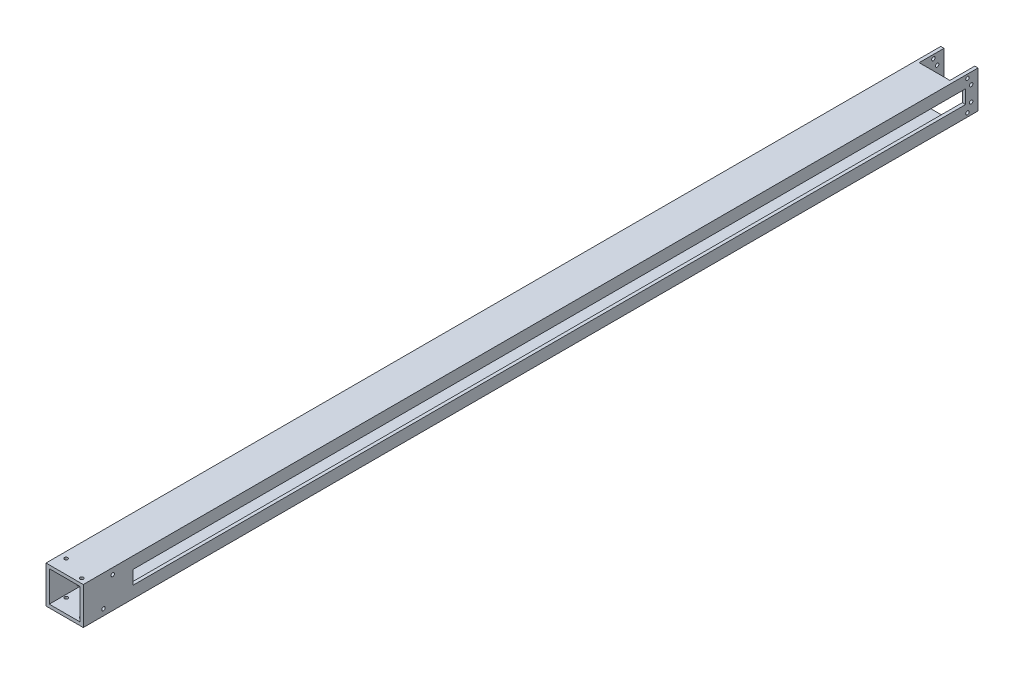
ISO-10303-21;
HEADER;
FILE_DESCRIPTION(('STEP AP214'),'2;1');
FILE_NAME('part.step','',(''),(''),'','','');
FILE_SCHEMA(('AUTOMOTIVE_DESIGN { 1 0 10303 214 1 1 1 1 }'));
ENDSEC;
DATA;
#1=APPLICATION_CONTEXT('core data for automotive mechanical design processes');
#2=APPLICATION_PROTOCOL_DEFINITION('international standard','automotive_design',2000,#1);
#3=PRODUCT_CONTEXT('',#1,'mechanical');
#4=PRODUCT('Part','Part','',(#3));
#5=PRODUCT_RELATED_PRODUCT_CATEGORY('part','',(#4));
#6=PRODUCT_DEFINITION_FORMATION('','',#4);
#7=PRODUCT_DEFINITION_CONTEXT('part definition',#1,'design');
#8=PRODUCT_DEFINITION('design','',#6,#7);
#9=PRODUCT_DEFINITION_SHAPE('','',#8);
#10=(LENGTH_UNIT() NAMED_UNIT(*) SI_UNIT(.MILLI.,.METRE.));
#11=(NAMED_UNIT(*) PLANE_ANGLE_UNIT() SI_UNIT($,.RADIAN.));
#12=(NAMED_UNIT(*) SI_UNIT($,.STERADIAN.) SOLID_ANGLE_UNIT());
#13=UNCERTAINTY_MEASURE_WITH_UNIT(LENGTH_MEASURE(1.E-05),#10,'distance_accuracy_value','');
#14=(GEOMETRIC_REPRESENTATION_CONTEXT(3) GLOBAL_UNCERTAINTY_ASSIGNED_CONTEXT((#13)) GLOBAL_UNIT_ASSIGNED_CONTEXT((#10,
#11,#12)) REPRESENTATION_CONTEXT('',''));
#15=CARTESIAN_POINT('',(0.,0.,0.));
#16=DIRECTION('',(0.,0.,1.));
#17=DIRECTION('',(1.,0.,0.));
#18=AXIS2_PLACEMENT_3D('',#15,#16,#17);
#19=CARTESIAN_POINT('',(0.,0.,0.));
#20=DIRECTION('',(0.,0.,1.));
#21=DIRECTION('',(1.,0.,0.));
#22=AXIS2_PLACEMENT_3D('',#19,#20,#21);
#23=PLANE('',#22);
#24=DIRECTION('',(-1.,0.,0.));
#25=VECTOR('',#24,1.);
#26=CARTESIAN_POINT('',(0.,-19.05,0.));
#27=LINE('',#26,#25);
#28=CARTESIAN_POINT('',(19.05,-19.05,0.));
#29=VERTEX_POINT('',#28);
#30=CARTESIAN_POINT('',(15.71625,-19.05,0.));
#31=VERTEX_POINT('',#30);
#32=EDGE_CURVE('E311',#29,#31,#27,.T.);
#33=ORIENTED_EDGE('',*,*,#32,.T.);
#34=DIRECTION('',(0.,-1.,0.));
#35=VECTOR('',#34,1.);
#36=CARTESIAN_POINT('',(15.71625,0.,0.));
#37=LINE('',#36,#35);
#38=CARTESIAN_POINT('',(15.71625,19.05,0.));
#39=VERTEX_POINT('',#38);
#40=EDGE_CURVE('E306',#39,#31,#37,.T.);
#41=ORIENTED_EDGE('',*,*,#40,.F.);
#42=DIRECTION('',(-1.,0.,0.));
#43=VECTOR('',#42,1.);
#44=CARTESIAN_POINT('',(0.,19.05,0.));
#45=LINE('',#44,#43);
#46=CARTESIAN_POINT('',(19.05,19.05,0.));
#47=VERTEX_POINT('',#46);
#48=EDGE_CURVE('E312',#47,#39,#45,.T.);
#49=ORIENTED_EDGE('',*,*,#48,.F.);
#50=DIRECTION('',(0.,-1.,0.));
#51=VECTOR('',#50,1.);
#52=CARTESIAN_POINT('',(19.05,0.,0.));
#53=LINE('',#52,#51);
#54=EDGE_CURVE('E308',#47,#29,#53,.T.);
#55=ORIENTED_EDGE('',*,*,#54,.T.);
#56=EDGE_LOOP('',(#33,#41,#49,#55));
#57=FACE_BOUND('',#56,.T.);
#58=ADVANCED_FACE('F41',(#57),#23,.F.);
#59=CARTESIAN_POINT('',(0.,6.98500000000004,914.4));
#60=DIRECTION('',(0.,1.,0.));
#61=DIRECTION('',(-1.,0.,0.));
#62=AXIS2_PLACEMENT_3D('',#59,#60,#61);
#63=PLANE('',#62);
#64=DIRECTION('',(0.,0.,-1.));
#65=VECTOR('',#64,1.);
#66=CARTESIAN_POINT('',(19.05,6.985,914.4));
#67=LINE('',#66,#65);
#68=CARTESIAN_POINT('',(19.05,6.985,863.6));
#69=VERTEX_POINT('',#68);
#70=CARTESIAN_POINT('',(19.05,6.985,12.7));
#71=VERTEX_POINT('',#70);
#72=EDGE_CURVE('E58',#69,#71,#67,.T.);
#73=ORIENTED_EDGE('',*,*,#72,.F.);
#74=DIRECTION('',(-1.,0.,0.));
#75=VECTOR('',#74,1.);
#76=CARTESIAN_POINT('',(0.,6.98500000000004,863.6));
#77=LINE('',#76,#75);
#78=CARTESIAN_POINT('',(15.71625,6.985,863.6));
#79=VERTEX_POINT('',#78);
#80=EDGE_CURVE('E160',#69,#79,#77,.T.);
#81=ORIENTED_EDGE('',*,*,#80,.T.);
#82=DIRECTION('',(0.,0.,-1.));
#83=VECTOR('',#82,1.);
#84=CARTESIAN_POINT('',(15.71625,6.985,914.4));
#85=LINE('',#84,#83);
#86=CARTESIAN_POINT('',(15.71625,6.985,12.7));
#87=VERTEX_POINT('',#86);
#88=EDGE_CURVE('E50',#79,#87,#85,.T.);
#89=ORIENTED_EDGE('',*,*,#88,.T.);
#90=DIRECTION('',(1.,0.,0.));
#91=VECTOR('',#90,1.);
#92=CARTESIAN_POINT('',(-3.16365730909453,6.985,12.7));
#93=LINE('',#92,#91);
#94=EDGE_CURVE('E226',#87,#71,#93,.T.);
#95=ORIENTED_EDGE('',*,*,#94,.T.);
#96=EDGE_LOOP('',(#73,#81,#89,#95));
#97=FACE_BOUND('',#96,.T.);
#98=ADVANCED_FACE('F43',(#97),#63,.F.);
#99=CARTESIAN_POINT('',(0.,19.05,914.4));
#100=DIRECTION('',(0.,-1.,0.));
#101=DIRECTION('',(0.,0.,-1.));
#102=AXIS2_PLACEMENT_3D('',#99,#100,#101);
#103=PLANE('',#102);
#104=DIRECTION('',(0.,0.,-1.));
#105=VECTOR('',#104,1.);
#106=CARTESIAN_POINT('',(19.05,19.05,914.4));
#107=LINE('',#106,#105);
#108=CARTESIAN_POINT('',(19.05,19.05,914.4));
#109=VERTEX_POINT('',#108);
#110=EDGE_CURVE('E343',#109,#47,#107,.T.);
#111=ORIENTED_EDGE('',*,*,#110,.T.);
#112=ORIENTED_EDGE('',*,*,#48,.T.);
#113=DIRECTION('',(0.,0.,-1.));
#114=VECTOR('',#113,1.);
#115=CARTESIAN_POINT('',(15.71625,19.05,-25.4));
#116=LINE('',#115,#114);
#117=CARTESIAN_POINT('',(15.71625,19.05,25.4));
#118=VERTEX_POINT('',#117);
#119=EDGE_CURVE('E239',#118,#39,#116,.T.);
#120=ORIENTED_EDGE('',*,*,#119,.F.);
#121=DIRECTION('',(1.,0.,0.));
#122=VECTOR('',#121,1.);
#123=CARTESIAN_POINT('',(-15.71625,19.05,25.4));
#124=LINE('',#123,#122);
#125=CARTESIAN_POINT('',(-15.71625,19.05,25.4));
#126=VERTEX_POINT('',#125);
#127=EDGE_CURVE('E245',#126,#118,#124,.T.);
#128=ORIENTED_EDGE('',*,*,#127,.F.);
#129=DIRECTION('',(0.,0.,1.));
#130=VECTOR('',#129,1.);
#131=CARTESIAN_POINT('',(-15.71625,19.05,-25.4));
#132=LINE('',#131,#130);
#133=CARTESIAN_POINT('',(-15.71625,19.05,0.));
#134=VERTEX_POINT('',#133);
#135=EDGE_CURVE('E242',#134,#126,#132,.T.);
#136=ORIENTED_EDGE('',*,*,#135,.F.);
#137=CARTESIAN_POINT('',(-19.05,19.05,0.));
#138=VERTEX_POINT('',#137);
#139=EDGE_CURVE('E284',#134,#138,#45,.T.);
#140=ORIENTED_EDGE('',*,*,#139,.T.);
#141=DIRECTION('',(0.,0.,-1.));
#142=VECTOR('',#141,1.);
#143=CARTESIAN_POINT('',(-19.05,19.05,914.4));
#144=LINE('',#143,#142);
#145=CARTESIAN_POINT('',(-19.05,19.05,914.4));
#146=VERTEX_POINT('',#145);
#147=EDGE_CURVE('E340',#146,#138,#144,.T.);
#148=ORIENTED_EDGE('',*,*,#147,.F.);
#149=DIRECTION('',(-1.,0.,0.));
#150=VECTOR('',#149,1.);
#151=CARTESIAN_POINT('',(0.,19.05,914.4));
#152=LINE('',#151,#150);
#153=EDGE_CURVE('E290',#109,#146,#152,.T.);
#154=ORIENTED_EDGE('',*,*,#153,.F.);
#155=EDGE_LOOP('',(#111,#112,#120,#128,#136,#140,#148,#154));
#156=FACE_BOUND('',#155,.T.);
#157=CARTESIAN_POINT('',(12.7,19.05,909.6375));
#158=DIRECTION('',(0.,-1.,0.));
#159=DIRECTION('',(0.,0.,-1.));
#160=AXIS2_PLACEMENT_3D('',#157,#158,#159);
#161=CIRCLE('',#160,1.7499999999999);
#162=CARTESIAN_POINT('',(12.7,19.05,907.8875));
#163=VERTEX_POINT('',#162);
#164=EDGE_CURVE('E281',#163,#163,#161,.T.);
#165=ORIENTED_EDGE('',*,*,#164,.T.);
#166=EDGE_LOOP('',(#165));
#167=FACE_BOUND('',#166,.T.);
#168=CARTESIAN_POINT('',(-12.7,19.05,900.1125));
#169=DIRECTION('',(0.,-1.,0.));
#170=DIRECTION('',(0.,0.,-1.));
#171=AXIS2_PLACEMENT_3D('',#168,#169,#170);
#172=CIRCLE('',#171,1.74999999999988);
#173=CARTESIAN_POINT('',(-12.7,19.05,898.3625));
#174=VERTEX_POINT('',#173);
#175=EDGE_CURVE('E271',#174,#174,#172,.T.);
#176=ORIENTED_EDGE('',*,*,#175,.T.);
#177=EDGE_LOOP('',(#176));
#178=FACE_BOUND('',#177,.T.);
#179=ADVANCED_FACE('F431',(#156,#167,#178),#103,.F.);
#180=CARTESIAN_POINT('',(-19.05,0.,914.4));
#181=DIRECTION('',(1.,0.,0.));
#182=DIRECTION('',(0.,1.,0.));
#183=AXIS2_PLACEMENT_3D('',#180,#181,#182);
#184=PLANE('',#183);
#185=CARTESIAN_POINT('',(-19.05,-12.7,884.2375));
#186=DIRECTION('',(-1.,0.,0.));
#187=DIRECTION('',(0.,-1.,0.));
#188=AXIS2_PLACEMENT_3D('',#185,#186,#187);
#189=CIRCLE('',#188,1.74999999999986);
#190=CARTESIAN_POINT('',(-19.05,-14.4499999999999,884.2375));
#191=VERTEX_POINT('',#190);
#192=EDGE_CURVE('E163',#191,#191,#189,.T.);
#193=ORIENTED_EDGE('',*,*,#192,.F.);
#194=EDGE_LOOP('',(#193));
#195=FACE_BOUND('',#194,.T.);
#196=CARTESIAN_POINT('',(-19.05,12.7,893.7625));
#197=DIRECTION('',(-1.,0.,0.));
#198=DIRECTION('',(0.,-1.,0.));
#199=AXIS2_PLACEMENT_3D('',#196,#197,#198);
#200=CIRCLE('',#199,1.74999999999987);
#201=CARTESIAN_POINT('',(-19.05,10.9500000000001,893.7625));
#202=VERTEX_POINT('',#201);
#203=EDGE_CURVE('E176',#202,#202,#200,.T.);
#204=ORIENTED_EDGE('',*,*,#203,.F.);
#205=EDGE_LOOP('',(#204));
#206=FACE_BOUND('',#205,.T.);
#207=CARTESIAN_POINT('',(-19.05,-15.24,10.795));
#208=DIRECTION('',(1.,0.,0.));
#209=DIRECTION('',(0.,1.,0.));
#210=AXIS2_PLACEMENT_3D('',#207,#208,#209);
#211=CIRCLE('',#210,1.75);
#212=CARTESIAN_POINT('',(-19.05,-13.49,10.795));
#213=VERTEX_POINT('',#212);
#214=EDGE_CURVE('E217',#213,#213,#211,.T.);
#215=ORIENTED_EDGE('',*,*,#214,.T.);
#216=EDGE_LOOP('',(#215));
#217=FACE_BOUND('',#216,.T.);
#218=CARTESIAN_POINT('',(-19.05,7.62,6.985));
#219=DIRECTION('',(1.,0.,0.));
#220=DIRECTION('',(0.,1.,0.));
#221=AXIS2_PLACEMENT_3D('',#218,#219,#220);
#222=CIRCLE('',#221,1.75);
#223=CARTESIAN_POINT('',(-19.05,9.37,6.985));
#224=VERTEX_POINT('',#223);
#225=EDGE_CURVE('E210',#224,#224,#222,.T.);
#226=ORIENTED_EDGE('',*,*,#225,.T.);
#227=EDGE_LOOP('',(#226));
#228=FACE_BOUND('',#227,.T.);
#229=CARTESIAN_POINT('',(-19.05,15.24,10.795));
#230=DIRECTION('',(1.,0.,0.));
#231=DIRECTION('',(0.,1.,0.));
#232=AXIS2_PLACEMENT_3D('',#229,#230,#231);
#233=CIRCLE('',#232,1.75);
#234=CARTESIAN_POINT('',(-19.05,16.99,10.795));
#235=VERTEX_POINT('',#234);
#236=EDGE_CURVE('E203',#235,#235,#233,.T.);
#237=ORIENTED_EDGE('',*,*,#236,.T.);
#238=EDGE_LOOP('',(#237));
#239=FACE_BOUND('',#238,.T.);
#240=CARTESIAN_POINT('',(-19.05,-7.62,6.985));
#241=DIRECTION('',(1.,0.,0.));
#242=DIRECTION('',(0.,1.,0.));
#243=AXIS2_PLACEMENT_3D('',#240,#241,#242);
#244=CIRCLE('',#243,1.75);
#245=CARTESIAN_POINT('',(-19.05,-5.87,6.985));
#246=VERTEX_POINT('',#245);
#247=EDGE_CURVE('E196',#246,#246,#244,.T.);
#248=ORIENTED_EDGE('',*,*,#247,.T.);
#249=EDGE_LOOP('',(#248));
#250=FACE_BOUND('',#249,.T.);
#251=DIRECTION('',(0.,-1.,0.));
#252=VECTOR('',#251,1.);
#253=CARTESIAN_POINT('',(-19.05,0.,0.));
#254=LINE('',#253,#252);
#255=CARTESIAN_POINT('',(-19.05,-19.05,0.));
#256=VERTEX_POINT('',#255);
#257=EDGE_CURVE('E315',#138,#256,#254,.T.);
#258=ORIENTED_EDGE('',*,*,#257,.T.);
#259=DIRECTION('',(0.,0.,-1.));
#260=VECTOR('',#259,1.);
#261=CARTESIAN_POINT('',(-19.05,-19.05,914.4));
#262=LINE('',#261,#260);
#263=CARTESIAN_POINT('',(-19.05,-19.05,914.4));
#264=VERTEX_POINT('',#263);
#265=EDGE_CURVE('E337',#264,#256,#262,.T.);
#266=ORIENTED_EDGE('',*,*,#265,.F.);
#267=DIRECTION('',(0.,-1.,0.));
#268=VECTOR('',#267,1.);
#269=CARTESIAN_POINT('',(-19.05,0.,914.4));
#270=LINE('',#269,#268);
#271=EDGE_CURVE('E292',#146,#264,#270,.T.);
#272=ORIENTED_EDGE('',*,*,#271,.F.);
#273=ORIENTED_EDGE('',*,*,#147,.T.);
#274=EDGE_LOOP('',(#258,#266,#272,#273));
#275=FACE_BOUND('',#274,.T.);
#276=ADVANCED_FACE('F421',(#195,#206,#217,#228,#239,#250,#275),#184,.F.);
#277=CARTESIAN_POINT('',(0.,-19.05,914.4));
#278=DIRECTION('',(0.,-1.,0.));
#279=DIRECTION('',(0.,0.,-1.));
#280=AXIS2_PLACEMENT_3D('',#277,#278,#279);
#281=PLANE('',#280);
#282=ORIENTED_EDGE('',*,*,#32,.F.);
#283=DIRECTION('',(0.,0.,-1.));
#284=VECTOR('',#283,1.);
#285=CARTESIAN_POINT('',(19.05,-19.05,914.4));
#286=LINE('',#285,#284);
#287=CARTESIAN_POINT('',(19.05,-19.05,914.4));
#288=VERTEX_POINT('',#287);
#289=EDGE_CURVE('E335',#288,#29,#286,.T.);
#290=ORIENTED_EDGE('',*,*,#289,.F.);
#291=DIRECTION('',(-1.,0.,0.));
#292=VECTOR('',#291,1.);
#293=CARTESIAN_POINT('',(0.,-19.05,914.4));
#294=LINE('',#293,#292);
#295=EDGE_CURVE('E295',#288,#264,#294,.T.);
#296=ORIENTED_EDGE('',*,*,#295,.T.);
#297=ORIENTED_EDGE('',*,*,#265,.T.);
#298=CARTESIAN_POINT('',(-15.71625,-19.05,0.));
#299=VERTEX_POINT('',#298);
#300=EDGE_CURVE('E318',#299,#256,#27,.T.);
#301=ORIENTED_EDGE('',*,*,#300,.F.);
#302=DIRECTION('',(0.,0.,-1.));
#303=VECTOR('',#302,1.);
#304=CARTESIAN_POINT('',(-15.71625,-19.05,914.4));
#305=LINE('',#304,#303);
#306=CARTESIAN_POINT('',(-15.71625,-19.05,25.4));
#307=VERTEX_POINT('',#306);
#308=EDGE_CURVE('E254',#307,#299,#305,.T.);
#309=ORIENTED_EDGE('',*,*,#308,.F.);
#310=DIRECTION('',(-1.,0.,0.));
#311=VECTOR('',#310,1.);
#312=CARTESIAN_POINT('',(-3.92503089513944E-13,-19.05,25.4));
#313=LINE('',#312,#311);
#314=CARTESIAN_POINT('',(15.71625,-19.05,25.4));
#315=VERTEX_POINT('',#314);
#316=EDGE_CURVE('E262',#315,#307,#313,.T.);
#317=ORIENTED_EDGE('',*,*,#316,.F.);
#318=DIRECTION('',(0.,0.,1.));
#319=VECTOR('',#318,1.);
#320=CARTESIAN_POINT('',(15.71625,-19.05,914.4));
#321=LINE('',#320,#319);
#322=EDGE_CURVE('E257',#31,#315,#321,.T.);
#323=ORIENTED_EDGE('',*,*,#322,.F.);
#324=EDGE_LOOP('',(#282,#290,#296,#297,#301,#309,#317,#323));
#325=FACE_BOUND('',#324,.T.);
#326=CARTESIAN_POINT('',(12.7,-19.05,909.6375));
#327=DIRECTION('',(0.,-1.,0.));
#328=DIRECTION('',(0.,0.,-1.));
#329=AXIS2_PLACEMENT_3D('',#326,#327,#328);
#330=CIRCLE('',#329,1.7499999999999);
#331=CARTESIAN_POINT('',(12.7,-19.05,907.8875));
#332=VERTEX_POINT('',#331);
#333=EDGE_CURVE('E278',#332,#332,#330,.T.);
#334=ORIENTED_EDGE('',*,*,#333,.F.);
#335=EDGE_LOOP('',(#334));
#336=FACE_BOUND('',#335,.T.);
#337=CARTESIAN_POINT('',(-12.7,-19.05,900.1125));
#338=DIRECTION('',(0.,-1.,0.));
#339=DIRECTION('',(0.,0.,-1.));
#340=AXIS2_PLACEMENT_3D('',#337,#338,#339);
#341=CIRCLE('',#340,1.74999999999988);
#342=CARTESIAN_POINT('',(-12.7,-19.05,898.3625));
#343=VERTEX_POINT('',#342);
#344=EDGE_CURVE('E268',#343,#343,#341,.T.);
#345=ORIENTED_EDGE('',*,*,#344,.F.);
#346=EDGE_LOOP('',(#345));
#347=FACE_BOUND('',#346,.T.);
#348=ADVANCED_FACE('F402',(#325,#336,#347),#281,.T.);
#349=CARTESIAN_POINT('',(19.05,0.,914.4));
#350=DIRECTION('',(1.,0.,0.));
#351=DIRECTION('',(0.,1.,0.));
#352=AXIS2_PLACEMENT_3D('',#349,#350,#351);
#353=PLANE('',#352);
#354=DIRECTION('',(0.,1.,0.));
#355=VECTOR('',#354,1.);
#356=CARTESIAN_POINT('',(19.05,-19.05,863.6));
#357=LINE('',#356,#355);
#358=CARTESIAN_POINT('',(19.05,-6.985,863.6));
#359=VERTEX_POINT('',#358);
#360=EDGE_CURVE('E169',#359,#69,#357,.T.);
#361=ORIENTED_EDGE('',*,*,#360,.T.);
#362=ORIENTED_EDGE('',*,*,#72,.T.);
#363=DIRECTION('',(0.,-1.,0.));
#364=VECTOR('',#363,1.);
#365=CARTESIAN_POINT('',(19.05,-6.985,12.7));
#366=LINE('',#365,#364);
#367=CARTESIAN_POINT('',(19.05,-6.985,12.7));
#368=VERTEX_POINT('',#367);
#369=EDGE_CURVE('E220',#71,#368,#366,.T.);
#370=ORIENTED_EDGE('',*,*,#369,.T.);
#371=DIRECTION('',(0.,0.,-1.));
#372=VECTOR('',#371,1.);
#373=CARTESIAN_POINT('',(19.05,-6.985,914.4));
#374=LINE('',#373,#372);
#375=EDGE_CURVE('E333',#359,#368,#374,.T.);
#376=ORIENTED_EDGE('',*,*,#375,.F.);
#377=EDGE_LOOP('',(#361,#362,#370,#376));
#378=FACE_BOUND('',#377,.T.);
#379=DIRECTION('',(0.,-1.,0.));
#380=VECTOR('',#379,1.);
#381=CARTESIAN_POINT('',(19.05,0.,914.4));
#382=LINE('',#381,#380);
#383=EDGE_CURVE('E287',#109,#288,#382,.T.);
#384=ORIENTED_EDGE('',*,*,#383,.T.);
#385=ORIENTED_EDGE('',*,*,#289,.T.);
#386=ORIENTED_EDGE('',*,*,#54,.F.);
#387=ORIENTED_EDGE('',*,*,#110,.F.);
#388=EDGE_LOOP('',(#384,#385,#386,#387));
#389=FACE_BOUND('',#388,.T.);
#390=CARTESIAN_POINT('',(19.05,-15.24,10.795));
#391=DIRECTION('',(1.,0.,0.));
#392=DIRECTION('',(0.,1.,0.));
#393=AXIS2_PLACEMENT_3D('',#390,#391,#392);
#394=CIRCLE('',#393,1.75);
#395=CARTESIAN_POINT('',(19.05,-13.49,10.795));
#396=VERTEX_POINT('',#395);
#397=EDGE_CURVE('E180',#396,#396,#394,.T.);
#398=ORIENTED_EDGE('',*,*,#397,.F.);
#399=EDGE_LOOP('',(#398));
#400=FACE_BOUND('',#399,.T.);
#401=CARTESIAN_POINT('',(19.05,7.62,6.985));
#402=DIRECTION('',(1.,0.,0.));
#403=DIRECTION('',(0.,1.,0.));
#404=AXIS2_PLACEMENT_3D('',#401,#402,#403);
#405=CIRCLE('',#404,1.75);
#406=CARTESIAN_POINT('',(19.05,9.37,6.985));
#407=VERTEX_POINT('',#406);
#408=EDGE_CURVE('E184',#407,#407,#405,.T.);
#409=ORIENTED_EDGE('',*,*,#408,.F.);
#410=EDGE_LOOP('',(#409));
#411=FACE_BOUND('',#410,.T.);
#412=CARTESIAN_POINT('',(19.05,15.24,10.795));
#413=DIRECTION('',(1.,0.,0.));
#414=DIRECTION('',(0.,-1.,0.));
#415=AXIS2_PLACEMENT_3D('',#412,#413,#414);
#416=CIRCLE('',#415,1.75);
#417=CARTESIAN_POINT('',(19.05,13.49,10.795));
#418=VERTEX_POINT('',#417);
#419=EDGE_CURVE('E187',#418,#418,#416,.T.);
#420=ORIENTED_EDGE('',*,*,#419,.F.);
#421=EDGE_LOOP('',(#420));
#422=FACE_BOUND('',#421,.T.);
#423=CARTESIAN_POINT('',(19.05,-7.62,6.985));
#424=DIRECTION('',(1.,0.,0.));
#425=DIRECTION('',(0.,-1.,0.));
#426=AXIS2_PLACEMENT_3D('',#423,#424,#425);
#427=CIRCLE('',#426,1.75);
#428=CARTESIAN_POINT('',(19.05,-9.37,6.985));
#429=VERTEX_POINT('',#428);
#430=EDGE_CURVE('E190',#429,#429,#427,.T.);
#431=ORIENTED_EDGE('',*,*,#430,.F.);
#432=EDGE_LOOP('',(#431));
#433=FACE_BOUND('',#432,.T.);
#434=CARTESIAN_POINT('',(19.05,12.7,884.2375));
#435=DIRECTION('',(1.,0.,0.));
#436=DIRECTION('',(0.,1.,0.));
#437=AXIS2_PLACEMENT_3D('',#434,#435,#436);
#438=CIRCLE('',#437,1.74999999999986);
#439=CARTESIAN_POINT('',(19.05,14.4499999999999,884.2375));
#440=VERTEX_POINT('',#439);
#441=EDGE_CURVE('E222',#440,#440,#438,.T.);
#442=ORIENTED_EDGE('',*,*,#441,.F.);
#443=EDGE_LOOP('',(#442));
#444=FACE_BOUND('',#443,.T.);
#445=CARTESIAN_POINT('',(19.05,-12.7,893.7625));
#446=DIRECTION('',(1.,0.,0.));
#447=DIRECTION('',(0.,1.,0.));
#448=AXIS2_PLACEMENT_3D('',#445,#446,#447);
#449=CIRCLE('',#448,1.74999999999987);
#450=CARTESIAN_POINT('',(19.05,-10.9500000000001,893.7625));
#451=VERTEX_POINT('',#450);
#452=EDGE_CURVE('E230',#451,#451,#449,.T.);
#453=ORIENTED_EDGE('',*,*,#452,.F.);
#454=EDGE_LOOP('',(#453));
#455=FACE_BOUND('',#454,.T.);
#456=ADVANCED_FACE('F409',(#378,#389,#400,#411,#422,#433,#444,#455),#353,.T.);
#457=CARTESIAN_POINT('',(0.,-6.98499999999996,914.4));
#458=DIRECTION('',(0.,1.,0.));
#459=DIRECTION('',(-1.,0.,0.));
#460=AXIS2_PLACEMENT_3D('',#457,#458,#459);
#461=PLANE('',#460);
#462=DIRECTION('',(-1.,0.,0.));
#463=VECTOR('',#462,1.);
#464=CARTESIAN_POINT('',(0.,-6.98499999999996,863.6));
#465=LINE('',#464,#463);
#466=CARTESIAN_POINT('',(15.71625,-6.985,863.6));
#467=VERTEX_POINT('',#466);
#468=EDGE_CURVE('E164',#359,#467,#465,.T.);
#469=ORIENTED_EDGE('',*,*,#468,.F.);
#470=ORIENTED_EDGE('',*,*,#375,.T.);
#471=DIRECTION('',(1.,0.,0.));
#472=VECTOR('',#471,1.);
#473=CARTESIAN_POINT('',(-3.16365730909453,-6.985,12.7));
#474=LINE('',#473,#472);
#475=CARTESIAN_POINT('',(15.71625,-6.985,12.7));
#476=VERTEX_POINT('',#475);
#477=EDGE_CURVE('E223',#476,#368,#474,.T.);
#478=ORIENTED_EDGE('',*,*,#477,.F.);
#479=DIRECTION('',(0.,0.,-1.));
#480=VECTOR('',#479,1.);
#481=CARTESIAN_POINT('',(15.71625,-6.985,914.4));
#482=LINE('',#481,#480);
#483=EDGE_CURVE('E331',#467,#476,#482,.T.);
#484=ORIENTED_EDGE('',*,*,#483,.F.);
#485=EDGE_LOOP('',(#469,#470,#478,#484));
#486=FACE_BOUND('',#485,.T.);
#487=ADVANCED_FACE('F464',(#486),#461,.T.);
#488=CARTESIAN_POINT('',(15.71625,0.,914.4));
#489=DIRECTION('',(1.,0.,0.));
#490=DIRECTION('',(0.,1.,0.));
#491=AXIS2_PLACEMENT_3D('',#488,#489,#490);
#492=PLANE('',#491);
#493=ORIENTED_EDGE('',*,*,#88,.F.);
#494=DIRECTION('',(0.,-1.,0.));
#495=VECTOR('',#494,1.);
#496=CARTESIAN_POINT('',(15.71625,-19.05,863.6));
#497=LINE('',#496,#495);
#498=EDGE_CURVE('E66',#79,#467,#497,.T.);
#499=ORIENTED_EDGE('',*,*,#498,.T.);
#500=ORIENTED_EDGE('',*,*,#483,.T.);
#501=DIRECTION('',(0.,1.,0.));
#502=VECTOR('',#501,1.);
#503=CARTESIAN_POINT('',(15.71625,-6.985,12.7));
#504=LINE('',#503,#502);
#505=EDGE_CURVE('E157',#476,#87,#504,.T.);
#506=ORIENTED_EDGE('',*,*,#505,.T.);
#507=EDGE_LOOP('',(#493,#499,#500,#506));
#508=FACE_BOUND('',#507,.T.);
#509=CARTESIAN_POINT('',(15.71625,-15.24,10.795));
#510=DIRECTION('',(1.,0.,0.));
#511=DIRECTION('',(0.,1.,0.));
#512=AXIS2_PLACEMENT_3D('',#509,#510,#511);
#513=CIRCLE('',#512,1.75);
#514=CARTESIAN_POINT('',(15.71625,-13.49,10.795));
#515=VERTEX_POINT('',#514);
#516=EDGE_CURVE('E214',#515,#515,#513,.T.);
#517=ORIENTED_EDGE('',*,*,#516,.T.);
#518=EDGE_LOOP('',(#517));
#519=FACE_BOUND('',#518,.T.);
#520=CARTESIAN_POINT('',(15.71625,7.62,6.985));
#521=DIRECTION('',(1.,0.,0.));
#522=DIRECTION('',(0.,1.,0.));
#523=AXIS2_PLACEMENT_3D('',#520,#521,#522);
#524=CIRCLE('',#523,1.75);
#525=CARTESIAN_POINT('',(15.71625,9.37,6.985));
#526=VERTEX_POINT('',#525);
#527=EDGE_CURVE('E207',#526,#526,#524,.T.);
#528=ORIENTED_EDGE('',*,*,#527,.T.);
#529=EDGE_LOOP('',(#528));
#530=FACE_BOUND('',#529,.T.);
#531=CARTESIAN_POINT('',(15.71625,15.24,10.795));
#532=DIRECTION('',(1.,0.,0.));
#533=DIRECTION('',(0.,1.,0.));
#534=AXIS2_PLACEMENT_3D('',#531,#532,#533);
#535=CIRCLE('',#534,1.75);
#536=CARTESIAN_POINT('',(15.71625,16.99,10.795));
#537=VERTEX_POINT('',#536);
#538=EDGE_CURVE('E200',#537,#537,#535,.T.);
#539=ORIENTED_EDGE('',*,*,#538,.T.);
#540=EDGE_LOOP('',(#539));
#541=FACE_BOUND('',#540,.T.);
#542=CARTESIAN_POINT('',(15.71625,-7.62,6.985));
#543=DIRECTION('',(1.,0.,0.));
#544=DIRECTION('',(0.,1.,0.));
#545=AXIS2_PLACEMENT_3D('',#542,#543,#544);
#546=CIRCLE('',#545,1.75);
#547=CARTESIAN_POINT('',(15.71625,-5.87,6.985));
#548=VERTEX_POINT('',#547);
#549=EDGE_CURVE('E193',#548,#548,#546,.T.);
#550=ORIENTED_EDGE('',*,*,#549,.T.);
#551=EDGE_LOOP('',(#550));
#552=FACE_BOUND('',#551,.T.);
#553=DIRECTION('',(0.,1.,0.));
#554=VECTOR('',#553,1.);
#555=CARTESIAN_POINT('',(15.71625,-52.832,25.4));
#556=LINE('',#555,#554);
#557=CARTESIAN_POINT('',(15.71625,-15.71625,25.4));
#558=VERTEX_POINT('',#557);
#559=EDGE_CURVE('E251',#315,#558,#556,.T.);
#560=ORIENTED_EDGE('',*,*,#559,.T.);
#561=DIRECTION('',(0.,0.,-1.));
#562=VECTOR('',#561,1.);
#563=CARTESIAN_POINT('',(15.71625,-15.71625,914.4));
#564=LINE('',#563,#562);
#565=CARTESIAN_POINT('',(15.71625,-15.71625,914.4));
#566=VERTEX_POINT('',#565);
#567=EDGE_CURVE('E329',#566,#558,#564,.T.);
#568=ORIENTED_EDGE('',*,*,#567,.F.);
#569=DIRECTION('',(0.,-1.,0.));
#570=VECTOR('',#569,1.);
#571=CARTESIAN_POINT('',(15.71625,0.,914.4));
#572=LINE('',#571,#570);
#573=CARTESIAN_POINT('',(15.71625,15.71625,914.4));
#574=VERTEX_POINT('',#573);
#575=EDGE_CURVE('E285',#574,#566,#572,.T.);
#576=ORIENTED_EDGE('',*,*,#575,.F.);
#577=DIRECTION('',(0.,0.,-1.));
#578=VECTOR('',#577,1.);
#579=CARTESIAN_POINT('',(15.71625,15.71625,914.4));
#580=LINE('',#579,#578);
#581=CARTESIAN_POINT('',(15.71625,15.71625,25.4));
#582=VERTEX_POINT('',#581);
#583=EDGE_CURVE('E305',#574,#582,#580,.T.);
#584=ORIENTED_EDGE('',*,*,#583,.T.);
#585=EDGE_CURVE('E249',#582,#118,#556,.T.);
#586=ORIENTED_EDGE('',*,*,#585,.T.);
#587=ORIENTED_EDGE('',*,*,#119,.T.);
#588=ORIENTED_EDGE('',*,*,#40,.T.);
#589=ORIENTED_EDGE('',*,*,#322,.T.);
#590=EDGE_LOOP('',(#560,#568,#576,#584,#586,#587,#588,#589));
#591=FACE_BOUND('',#590,.T.);
#592=CARTESIAN_POINT('',(15.71625,12.7,884.2375));
#593=DIRECTION('',(1.,0.,0.));
#594=DIRECTION('',(0.,1.,0.));
#595=AXIS2_PLACEMENT_3D('',#592,#593,#594);
#596=CIRCLE('',#595,1.74999999999986);
#597=CARTESIAN_POINT('',(15.71625,14.4499999999999,884.2375));
#598=VERTEX_POINT('',#597);
#599=EDGE_CURVE('E236',#598,#598,#596,.T.);
#600=ORIENTED_EDGE('',*,*,#599,.T.);
#601=EDGE_LOOP('',(#600));
#602=FACE_BOUND('',#601,.T.);
#603=CARTESIAN_POINT('',(15.71625,-12.7,893.7625));
#604=DIRECTION('',(1.,0.,0.));
#605=DIRECTION('',(0.,1.,0.));
#606=AXIS2_PLACEMENT_3D('',#603,#604,#605);
#607=CIRCLE('',#606,1.74999999999987);
#608=CARTESIAN_POINT('',(15.71625,-10.9500000000001,893.7625));
#609=VERTEX_POINT('',#608);
#610=EDGE_CURVE('E233',#609,#609,#607,.T.);
#611=ORIENTED_EDGE('',*,*,#610,.T.);
#612=EDGE_LOOP('',(#611));
#613=FACE_BOUND('',#612,.T.);
#614=ADVANCED_FACE('F154',(#508,#519,#530,#541,#552,#591,#602,#613),#492,.F.);
#615=CARTESIAN_POINT('',(0.,-15.71625,914.4));
#616=DIRECTION('',(0.,-1.,0.));
#617=DIRECTION('',(0.,0.,-1.));
#618=AXIS2_PLACEMENT_3D('',#615,#616,#617);
#619=PLANE('',#618);
#620=CARTESIAN_POINT('',(12.7,-15.71625,909.6375));
#621=DIRECTION('',(0.,-1.,0.));
#622=DIRECTION('',(0.,0.,-1.));
#623=AXIS2_PLACEMENT_3D('',#620,#621,#622);
#624=CIRCLE('',#623,1.7499999999999);
#625=CARTESIAN_POINT('',(12.7,-15.71625,907.8875));
#626=VERTEX_POINT('',#625);
#627=EDGE_CURVE('E275',#626,#626,#624,.T.);
#628=ORIENTED_EDGE('',*,*,#627,.T.);
#629=EDGE_LOOP('',(#628));
#630=FACE_BOUND('',#629,.T.);
#631=CARTESIAN_POINT('',(-12.7,-15.71625,900.1125));
#632=DIRECTION('',(0.,-1.,0.));
#633=DIRECTION('',(0.,0.,-1.));
#634=AXIS2_PLACEMENT_3D('',#631,#632,#633);
#635=CIRCLE('',#634,1.74999999999988);
#636=CARTESIAN_POINT('',(-12.7,-15.71625,898.3625));
#637=VERTEX_POINT('',#636);
#638=EDGE_CURVE('E265',#637,#637,#635,.T.);
#639=ORIENTED_EDGE('',*,*,#638,.T.);
#640=EDGE_LOOP('',(#639));
#641=FACE_BOUND('',#640,.T.);
#642=ORIENTED_EDGE('',*,*,#567,.T.);
#643=DIRECTION('',(-1.,0.,0.));
#644=VECTOR('',#643,1.);
#645=CARTESIAN_POINT('',(-3.92503089513944E-13,-15.71625,25.4));
#646=LINE('',#645,#644);
#647=CARTESIAN_POINT('',(-15.71625,-15.71625,25.4));
#648=VERTEX_POINT('',#647);
#649=EDGE_CURVE('E259',#558,#648,#646,.T.);
#650=ORIENTED_EDGE('',*,*,#649,.T.);
#651=DIRECTION('',(0.,0.,-1.));
#652=VECTOR('',#651,1.);
#653=CARTESIAN_POINT('',(-15.71625,-15.71625,914.4));
#654=LINE('',#653,#652);
#655=CARTESIAN_POINT('',(-15.71625,-15.71625,914.4));
#656=VERTEX_POINT('',#655);
#657=EDGE_CURVE('E326',#656,#648,#654,.T.);
#658=ORIENTED_EDGE('',*,*,#657,.F.);
#659=DIRECTION('',(-1.,0.,0.));
#660=VECTOR('',#659,1.);
#661=CARTESIAN_POINT('',(0.,-15.71625,914.4));
#662=LINE('',#661,#660);
#663=EDGE_CURVE('E297',#566,#656,#662,.T.);
#664=ORIENTED_EDGE('',*,*,#663,.F.);
#665=EDGE_LOOP('',(#642,#650,#658,#664));
#666=FACE_BOUND('',#665,.T.);
#667=ADVANCED_FACE('F372',(#630,#641,#666),#619,.F.);
#668=CARTESIAN_POINT('',(-15.71625,0.,914.4));
#669=DIRECTION('',(1.,0.,0.));
#670=DIRECTION('',(0.,0.,-1.));
#671=AXIS2_PLACEMENT_3D('',#668,#669,#670);
#672=PLANE('',#671);
#673=CARTESIAN_POINT('',(-15.71625,-12.7,884.2375));
#674=DIRECTION('',(1.,0.,0.));
#675=DIRECTION('',(0.,0.,-1.));
#676=AXIS2_PLACEMENT_3D('',#673,#674,#675);
#677=CIRCLE('',#676,1.74999999999986);
#678=CARTESIAN_POINT('',(-15.71625,-12.7,882.4875));
#679=VERTEX_POINT('',#678);
#680=EDGE_CURVE('E45',#679,#679,#677,.T.);
#681=ORIENTED_EDGE('',*,*,#680,.F.);
#682=EDGE_LOOP('',(#681));
#683=FACE_BOUND('',#682,.T.);
#684=CARTESIAN_POINT('',(-15.71625,12.7,893.7625));
#685=DIRECTION('',(1.,0.,0.));
#686=DIRECTION('',(0.,0.,-1.));
#687=AXIS2_PLACEMENT_3D('',#684,#685,#686);
#688=CIRCLE('',#687,1.74999999999987);
#689=CARTESIAN_POINT('',(-15.71625,12.7,892.0125));
#690=VERTEX_POINT('',#689);
#691=EDGE_CURVE('E179',#690,#690,#688,.T.);
#692=ORIENTED_EDGE('',*,*,#691,.F.);
#693=EDGE_LOOP('',(#692));
#694=FACE_BOUND('',#693,.T.);
#695=CARTESIAN_POINT('',(-15.71625,-15.24,10.795));
#696=DIRECTION('',(1.,0.,0.));
#697=DIRECTION('',(0.,0.,-1.));
#698=AXIS2_PLACEMENT_3D('',#695,#696,#697);
#699=CIRCLE('',#698,1.75);
#700=CARTESIAN_POINT('',(-15.71625,-15.24,9.045));
#701=VERTEX_POINT('',#700);
#702=EDGE_CURVE('E213',#701,#701,#699,.T.);
#703=ORIENTED_EDGE('',*,*,#702,.F.);
#704=EDGE_LOOP('',(#703));
#705=FACE_BOUND('',#704,.T.);
#706=CARTESIAN_POINT('',(-15.71625,7.62,6.985));
#707=DIRECTION('',(1.,0.,0.));
#708=DIRECTION('',(0.,0.,-1.));
#709=AXIS2_PLACEMENT_3D('',#706,#707,#708);
#710=CIRCLE('',#709,1.75);
#711=CARTESIAN_POINT('',(-15.71625,7.62,5.235));
#712=VERTEX_POINT('',#711);
#713=EDGE_CURVE('E206',#712,#712,#710,.T.);
#714=ORIENTED_EDGE('',*,*,#713,.F.);
#715=EDGE_LOOP('',(#714));
#716=FACE_BOUND('',#715,.T.);
#717=CARTESIAN_POINT('',(-15.71625,15.24,10.795));
#718=DIRECTION('',(1.,0.,0.));
#719=DIRECTION('',(0.,0.,-1.));
#720=AXIS2_PLACEMENT_3D('',#717,#718,#719);
#721=CIRCLE('',#720,1.75);
#722=CARTESIAN_POINT('',(-15.71625,15.24,9.045));
#723=VERTEX_POINT('',#722);
#724=EDGE_CURVE('E199',#723,#723,#721,.T.);
#725=ORIENTED_EDGE('',*,*,#724,.F.);
#726=EDGE_LOOP('',(#725));
#727=FACE_BOUND('',#726,.T.);
#728=CARTESIAN_POINT('',(-15.71625,-7.62,6.985));
#729=DIRECTION('',(1.,0.,0.));
#730=DIRECTION('',(0.,0.,-1.));
#731=AXIS2_PLACEMENT_3D('',#728,#729,#730);
#732=CIRCLE('',#731,1.75);
#733=CARTESIAN_POINT('',(-15.71625,-7.62,5.235));
#734=VERTEX_POINT('',#733);
#735=EDGE_CURVE('E183',#734,#734,#732,.T.);
#736=ORIENTED_EDGE('',*,*,#735,.F.);
#737=EDGE_LOOP('',(#736));
#738=FACE_BOUND('',#737,.T.);
#739=ORIENTED_EDGE('',*,*,#657,.T.);
#740=DIRECTION('',(0.,1.,0.));
#741=VECTOR('',#740,1.);
#742=CARTESIAN_POINT('',(-15.71625,-52.832,25.4));
#743=LINE('',#742,#741);
#744=EDGE_CURVE('E252',#307,#648,#743,.T.);
#745=ORIENTED_EDGE('',*,*,#744,.F.);
#746=ORIENTED_EDGE('',*,*,#308,.T.);
#747=DIRECTION('',(0.,-1.,0.));
#748=VECTOR('',#747,1.);
#749=CARTESIAN_POINT('',(-15.71625,0.,0.));
#750=LINE('',#749,#748);
#751=EDGE_CURVE('E288',#134,#299,#750,.T.);
#752=ORIENTED_EDGE('',*,*,#751,.F.);
#753=ORIENTED_EDGE('',*,*,#135,.T.);
#754=CARTESIAN_POINT('',(-15.71625,15.71625,25.4));
#755=VERTEX_POINT('',#754);
#756=EDGE_CURVE('E248',#755,#126,#743,.T.);
#757=ORIENTED_EDGE('',*,*,#756,.F.);
#758=DIRECTION('',(0.,0.,-1.));
#759=VECTOR('',#758,1.);
#760=CARTESIAN_POINT('',(-15.71625,15.71625,914.4));
#761=LINE('',#760,#759);
#762=CARTESIAN_POINT('',(-15.71625,15.71625,914.4));
#763=VERTEX_POINT('',#762);
#764=EDGE_CURVE('E323',#763,#755,#761,.T.);
#765=ORIENTED_EDGE('',*,*,#764,.F.);
#766=DIRECTION('',(0.,-1.,0.));
#767=VECTOR('',#766,1.);
#768=CARTESIAN_POINT('',(-15.71625,0.,914.4));
#769=LINE('',#768,#767);
#770=EDGE_CURVE('E299',#763,#656,#769,.T.);
#771=ORIENTED_EDGE('',*,*,#770,.T.);
#772=EDGE_LOOP('',(#739,#745,#746,#752,#753,#757,#765,#771));
#773=FACE_BOUND('',#772,.T.);
#774=ADVANCED_FACE('F368',(#683,#694,#705,#716,#727,#738,#773),#672,.T.);
#775=CARTESIAN_POINT('',(0.,15.71625,914.4));
#776=DIRECTION('',(0.,-1.,0.));
#777=DIRECTION('',(0.,0.,-1.));
#778=AXIS2_PLACEMENT_3D('',#775,#776,#777);
#779=PLANE('',#778);
#780=DIRECTION('',(-1.,0.,0.));
#781=VECTOR('',#780,1.);
#782=CARTESIAN_POINT('',(-3.92503089513944E-13,15.71625,25.4));
#783=LINE('',#782,#781);
#784=EDGE_CURVE('E11',#582,#755,#783,.T.);
#785=ORIENTED_EDGE('',*,*,#784,.F.);
#786=ORIENTED_EDGE('',*,*,#583,.F.);
#787=DIRECTION('',(-1.,0.,0.));
#788=VECTOR('',#787,1.);
#789=CARTESIAN_POINT('',(0.,15.71625,914.4));
#790=LINE('',#789,#788);
#791=EDGE_CURVE('E302',#574,#763,#790,.T.);
#792=ORIENTED_EDGE('',*,*,#791,.T.);
#793=ORIENTED_EDGE('',*,*,#764,.T.);
#794=EDGE_LOOP('',(#785,#786,#792,#793));
#795=FACE_BOUND('',#794,.T.);
#796=CARTESIAN_POINT('',(12.7,15.71625,909.6375));
#797=DIRECTION('',(0.,-1.,0.));
#798=DIRECTION('',(0.,0.,-1.));
#799=AXIS2_PLACEMENT_3D('',#796,#797,#798);
#800=CIRCLE('',#799,1.7499999999999);
#801=CARTESIAN_POINT('',(12.7,15.71625,907.8875));
#802=VERTEX_POINT('',#801);
#803=EDGE_CURVE('E274',#802,#802,#800,.T.);
#804=ORIENTED_EDGE('',*,*,#803,.F.);
#805=EDGE_LOOP('',(#804));
#806=FACE_BOUND('',#805,.T.);
#807=CARTESIAN_POINT('',(-12.7,15.71625,900.1125));
#808=DIRECTION('',(0.,-1.,0.));
#809=DIRECTION('',(0.,0.,-1.));
#810=AXIS2_PLACEMENT_3D('',#807,#808,#809);
#811=CIRCLE('',#810,1.74999999999988);
#812=CARTESIAN_POINT('',(-12.7,15.71625,898.3625));
#813=VERTEX_POINT('',#812);
#814=EDGE_CURVE('E264',#813,#813,#811,.T.);
#815=ORIENTED_EDGE('',*,*,#814,.F.);
#816=EDGE_LOOP('',(#815));
#817=FACE_BOUND('',#816,.T.);
#818=ADVANCED_FACE('F371',(#795,#806,#817),#779,.T.);
#819=CARTESIAN_POINT('',(0.,0.,914.4));
#820=DIRECTION('',(0.,0.,1.));
#821=DIRECTION('',(1.,0.,0.));
#822=AXIS2_PLACEMENT_3D('',#819,#820,#821);
#823=PLANE('',#822);
#824=ORIENTED_EDGE('',*,*,#295,.F.);
#825=ORIENTED_EDGE('',*,*,#383,.F.);
#826=ORIENTED_EDGE('',*,*,#153,.T.);
#827=ORIENTED_EDGE('',*,*,#271,.T.);
#828=EDGE_LOOP('',(#824,#825,#826,#827));
#829=FACE_BOUND('',#828,.T.);
#830=ORIENTED_EDGE('',*,*,#575,.T.);
#831=ORIENTED_EDGE('',*,*,#663,.T.);
#832=ORIENTED_EDGE('',*,*,#770,.F.);
#833=ORIENTED_EDGE('',*,*,#791,.F.);
#834=EDGE_LOOP('',(#830,#831,#832,#833));
#835=FACE_BOUND('',#834,.T.);
#836=ADVANCED_FACE('F415',(#829,#835),#823,.T.);
#837=ORIENTED_EDGE('',*,*,#139,.F.);
#838=ORIENTED_EDGE('',*,*,#751,.T.);
#839=ORIENTED_EDGE('',*,*,#300,.T.);
#840=ORIENTED_EDGE('',*,*,#257,.F.);
#841=EDGE_LOOP('',(#837,#838,#839,#840));
#842=FACE_BOUND('',#841,.T.);
#843=ADVANCED_FACE('F426',(#842),#23,.F.);
#844=CARTESIAN_POINT('',(-12.7,-58.42,900.1125));
#845=DIRECTION('',(0.,1.,0.));
#846=DIRECTION('',(0.,0.,1.));
#847=AXIS2_PLACEMENT_3D('',#844,#845,#846);
#848=CYLINDRICAL_SURFACE('',#847,1.74999999999988);
#849=ORIENTED_EDGE('',*,*,#814,.T.);
#850=EDGE_LOOP('',(#849));
#851=FACE_BOUND('',#850,.T.);
#852=ORIENTED_EDGE('',*,*,#175,.F.);
#853=EDGE_LOOP('',(#852));
#854=FACE_BOUND('',#853,.T.);
#855=ADVANCED_FACE('F448',(#851,#854),#848,.F.);
#856=CARTESIAN_POINT('',(12.7,-58.42,909.6375));
#857=DIRECTION('',(0.,1.,0.));
#858=DIRECTION('',(0.,0.,1.));
#859=AXIS2_PLACEMENT_3D('',#856,#857,#858);
#860=CYLINDRICAL_SURFACE('',#859,1.7499999999999);
#861=ORIENTED_EDGE('',*,*,#803,.T.);
#862=EDGE_LOOP('',(#861));
#863=FACE_BOUND('',#862,.T.);
#864=ORIENTED_EDGE('',*,*,#164,.F.);
#865=EDGE_LOOP('',(#864));
#866=FACE_BOUND('',#865,.T.);
#867=ADVANCED_FACE('F548',(#863,#866),#860,.F.);
#868=ORIENTED_EDGE('',*,*,#344,.T.);
#869=EDGE_LOOP('',(#868));
#870=FACE_BOUND('',#869,.T.);
#871=ORIENTED_EDGE('',*,*,#638,.F.);
#872=EDGE_LOOP('',(#871));
#873=FACE_BOUND('',#872,.T.);
#874=ADVANCED_FACE('F550',(#870,#873),#848,.F.);
#875=ORIENTED_EDGE('',*,*,#333,.T.);
#876=EDGE_LOOP('',(#875));
#877=FACE_BOUND('',#876,.T.);
#878=ORIENTED_EDGE('',*,*,#627,.F.);
#879=EDGE_LOOP('',(#878));
#880=FACE_BOUND('',#879,.T.);
#881=ADVANCED_FACE('F560',(#877,#880),#860,.F.);
#882=CARTESIAN_POINT('',(-15.71625,-52.832,25.4));
#883=DIRECTION('',(0.,0.,1.));
#884=DIRECTION('',(1.,0.,0.));
#885=AXIS2_PLACEMENT_3D('',#882,#883,#884);
#886=PLANE('',#885);
#887=ORIENTED_EDGE('',*,*,#316,.T.);
#888=ORIENTED_EDGE('',*,*,#744,.T.);
#889=ORIENTED_EDGE('',*,*,#649,.F.);
#890=ORIENTED_EDGE('',*,*,#559,.F.);
#891=EDGE_LOOP('',(#887,#888,#889,#890));
#892=FACE_BOUND('',#891,.T.);
#893=ADVANCED_FACE('F394',(#892),#886,.F.);
#894=ORIENTED_EDGE('',*,*,#784,.T.);
#895=ORIENTED_EDGE('',*,*,#756,.T.);
#896=ORIENTED_EDGE('',*,*,#127,.T.);
#897=ORIENTED_EDGE('',*,*,#585,.F.);
#898=EDGE_LOOP('',(#894,#895,#896,#897));
#899=FACE_BOUND('',#898,.T.);
#900=ADVANCED_FACE('F436',(#899),#886,.F.);
#901=CARTESIAN_POINT('',(6.35,-12.7,893.7625));
#902=DIRECTION('',(1.,0.,0.));
#903=DIRECTION('',(0.,1.,0.));
#904=AXIS2_PLACEMENT_3D('',#901,#902,#903);
#905=CYLINDRICAL_SURFACE('',#904,1.74999999999987);
#906=ORIENTED_EDGE('',*,*,#452,.T.);
#907=EDGE_LOOP('',(#906));
#908=FACE_BOUND('',#907,.T.);
#909=ORIENTED_EDGE('',*,*,#610,.F.);
#910=EDGE_LOOP('',(#909));
#911=FACE_BOUND('',#910,.T.);
#912=ADVANCED_FACE('F609',(#908,#911),#905,.F.);
#913=CARTESIAN_POINT('',(6.35,12.7,884.2375));
#914=DIRECTION('',(1.,0.,0.));
#915=DIRECTION('',(0.,1.,0.));
#916=AXIS2_PLACEMENT_3D('',#913,#914,#915);
#917=CYLINDRICAL_SURFACE('',#916,1.74999999999986);
#918=ORIENTED_EDGE('',*,*,#441,.T.);
#919=EDGE_LOOP('',(#918));
#920=FACE_BOUND('',#919,.T.);
#921=ORIENTED_EDGE('',*,*,#599,.F.);
#922=EDGE_LOOP('',(#921));
#923=FACE_BOUND('',#922,.T.);
#924=ADVANCED_FACE('F617',(#920,#923),#917,.F.);
#925=CARTESIAN_POINT('',(-3.16365730909453,-6.985,12.7));
#926=DIRECTION('',(0.,0.,1.));
#927=DIRECTION('',(0.,-1.,0.));
#928=AXIS2_PLACEMENT_3D('',#925,#926,#927);
#929=PLANE('',#928);
#930=ORIENTED_EDGE('',*,*,#505,.F.);
#931=ORIENTED_EDGE('',*,*,#477,.T.);
#932=ORIENTED_EDGE('',*,*,#369,.F.);
#933=ORIENTED_EDGE('',*,*,#94,.F.);
#934=EDGE_LOOP('',(#930,#931,#932,#933));
#935=FACE_BOUND('',#934,.T.);
#936=ADVANCED_FACE('F626',(#935),#929,.T.);
#937=CARTESIAN_POINT('',(-49.276,-7.62000000000001,6.985));
#938=DIRECTION('',(1.,0.,0.));
#939=DIRECTION('',(0.,1.,0.));
#940=AXIS2_PLACEMENT_3D('',#937,#938,#939);
#941=CYLINDRICAL_SURFACE('',#940,1.75);
#942=ORIENTED_EDGE('',*,*,#735,.T.);
#943=EDGE_LOOP('',(#942));
#944=FACE_BOUND('',#943,.T.);
#945=ORIENTED_EDGE('',*,*,#247,.F.);
#946=EDGE_LOOP('',(#945));
#947=FACE_BOUND('',#946,.T.);
#948=ADVANCED_FACE('F650',(#944,#947),#941,.F.);
#949=CARTESIAN_POINT('',(-49.276,15.24,10.795));
#950=DIRECTION('',(1.,0.,0.));
#951=DIRECTION('',(0.,1.,0.));
#952=AXIS2_PLACEMENT_3D('',#949,#950,#951);
#953=CYLINDRICAL_SURFACE('',#952,1.75);
#954=ORIENTED_EDGE('',*,*,#724,.T.);
#955=EDGE_LOOP('',(#954));
#956=FACE_BOUND('',#955,.T.);
#957=ORIENTED_EDGE('',*,*,#236,.F.);
#958=EDGE_LOOP('',(#957));
#959=FACE_BOUND('',#958,.T.);
#960=ADVANCED_FACE('F660',(#956,#959),#953,.F.);
#961=CARTESIAN_POINT('',(-49.276,7.62,6.985));
#962=DIRECTION('',(1.,0.,0.));
#963=DIRECTION('',(0.,1.,0.));
#964=AXIS2_PLACEMENT_3D('',#961,#962,#963);
#965=CYLINDRICAL_SURFACE('',#964,1.75);
#966=ORIENTED_EDGE('',*,*,#713,.T.);
#967=EDGE_LOOP('',(#966));
#968=FACE_BOUND('',#967,.T.);
#969=ORIENTED_EDGE('',*,*,#225,.F.);
#970=EDGE_LOOP('',(#969));
#971=FACE_BOUND('',#970,.T.);
#972=ADVANCED_FACE('F671',(#968,#971),#965,.F.);
#973=CARTESIAN_POINT('',(-49.276,-15.24,10.795));
#974=DIRECTION('',(1.,0.,0.));
#975=DIRECTION('',(0.,1.,0.));
#976=AXIS2_PLACEMENT_3D('',#973,#974,#975);
#977=CYLINDRICAL_SURFACE('',#976,1.75);
#978=ORIENTED_EDGE('',*,*,#702,.T.);
#979=EDGE_LOOP('',(#978));
#980=FACE_BOUND('',#979,.T.);
#981=ORIENTED_EDGE('',*,*,#214,.F.);
#982=EDGE_LOOP('',(#981));
#983=FACE_BOUND('',#982,.T.);
#984=ADVANCED_FACE('F682',(#980,#983),#977,.F.);
#985=ORIENTED_EDGE('',*,*,#430,.T.);
#986=EDGE_LOOP('',(#985));
#987=FACE_BOUND('',#986,.T.);
#988=ORIENTED_EDGE('',*,*,#549,.F.);
#989=EDGE_LOOP('',(#988));
#990=FACE_BOUND('',#989,.T.);
#991=ADVANCED_FACE('F663',(#987,#990),#941,.F.);
#992=ORIENTED_EDGE('',*,*,#419,.T.);
#993=EDGE_LOOP('',(#992));
#994=FACE_BOUND('',#993,.T.);
#995=ORIENTED_EDGE('',*,*,#538,.F.);
#996=EDGE_LOOP('',(#995));
#997=FACE_BOUND('',#996,.T.);
#998=ADVANCED_FACE('F674',(#994,#997),#953,.F.);
#999=ORIENTED_EDGE('',*,*,#408,.T.);
#1000=EDGE_LOOP('',(#999));
#1001=FACE_BOUND('',#1000,.T.);
#1002=ORIENTED_EDGE('',*,*,#527,.F.);
#1003=EDGE_LOOP('',(#1002));
#1004=FACE_BOUND('',#1003,.T.);
#1005=ADVANCED_FACE('F685',(#1001,#1004),#965,.F.);
#1006=ORIENTED_EDGE('',*,*,#397,.T.);
#1007=EDGE_LOOP('',(#1006));
#1008=FACE_BOUND('',#1007,.T.);
#1009=ORIENTED_EDGE('',*,*,#516,.F.);
#1010=EDGE_LOOP('',(#1009));
#1011=FACE_BOUND('',#1010,.T.);
#1012=ADVANCED_FACE('F695',(#1008,#1011),#977,.F.);
#1013=CARTESIAN_POINT('',(-6.35,12.7,893.7625));
#1014=DIRECTION('',(-1.,0.,0.));
#1015=DIRECTION('',(0.,-1.,0.));
#1016=AXIS2_PLACEMENT_3D('',#1013,#1014,#1015);
#1017=CYLINDRICAL_SURFACE('',#1016,1.74999999999987);
#1018=ORIENTED_EDGE('',*,*,#691,.T.);
#1019=EDGE_LOOP('',(#1018));
#1020=FACE_BOUND('',#1019,.T.);
#1021=ORIENTED_EDGE('',*,*,#203,.T.);
#1022=EDGE_LOOP('',(#1021));
#1023=FACE_BOUND('',#1022,.T.);
#1024=ADVANCED_FACE('F727',(#1020,#1023),#1017,.F.);
#1025=CARTESIAN_POINT('',(-6.35,-12.7,884.2375));
#1026=DIRECTION('',(-1.,0.,0.));
#1027=DIRECTION('',(0.,-1.,0.));
#1028=AXIS2_PLACEMENT_3D('',#1025,#1026,#1027);
#1029=CYLINDRICAL_SURFACE('',#1028,1.74999999999986);
#1030=ORIENTED_EDGE('',*,*,#680,.T.);
#1031=EDGE_LOOP('',(#1030));
#1032=FACE_BOUND('',#1031,.T.);
#1033=ORIENTED_EDGE('',*,*,#192,.T.);
#1034=EDGE_LOOP('',(#1033));
#1035=FACE_BOUND('',#1034,.T.);
#1036=ADVANCED_FACE('F365',(#1032,#1035),#1029,.F.);
#1037=CARTESIAN_POINT('',(-47.78375,-19.05,863.6));
#1038=DIRECTION('',(0.,0.,-1.));
#1039=DIRECTION('',(-1.,0.,0.));
#1040=AXIS2_PLACEMENT_3D('',#1037,#1038,#1039);
#1041=PLANE('',#1040);
#1042=ORIENTED_EDGE('',*,*,#80,.F.);
#1043=ORIENTED_EDGE('',*,*,#360,.F.);
#1044=ORIENTED_EDGE('',*,*,#468,.T.);
#1045=ORIENTED_EDGE('',*,*,#498,.F.);
#1046=EDGE_LOOP('',(#1042,#1043,#1044,#1045));
#1047=FACE_BOUND('',#1046,.T.);
#1048=ADVANCED_FACE('F166',(#1047),#1041,.T.);
#1049=CLOSED_SHELL('',(#58,#98,#179,#276,#348,#456,#487,#614,#667,#774,#818,#836,#843,#855,#867,
#874,#881,#893,#900,#912,#924,#936,#948,#960,#972,#984,#991,#998,#1005,#1012,#1024,#1036,#1048));
#1050=MANIFOLD_SOLID_BREP('B2',#1049);
#1051=ADVANCED_BREP_SHAPE_REPRESENTATION('',(#18,#1050),#14);
#1052=SHAPE_DEFINITION_REPRESENTATION(#9,#1051);
ENDSEC;
END-ISO-10303-21;
